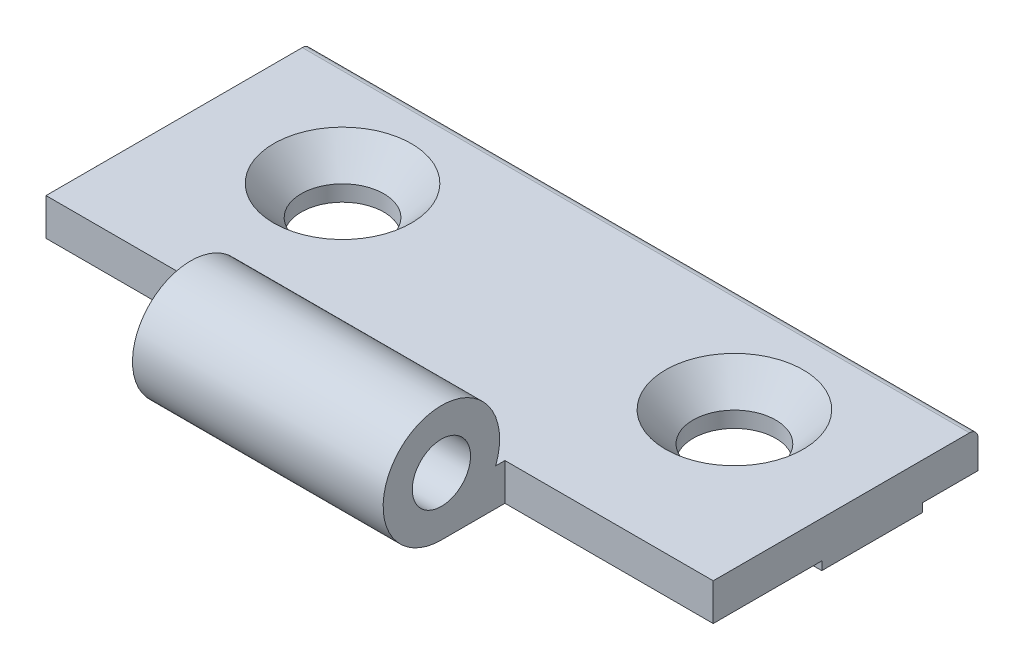
ISO-10303-21;
HEADER;
FILE_DESCRIPTION(('STEP AP214'),'2;1');
FILE_NAME('part.step','',(''),(''),'','','');
FILE_SCHEMA(('AUTOMOTIVE_DESIGN { 1 0 10303 214 1 1 1 1 }'));
ENDSEC;
DATA;
#1=APPLICATION_CONTEXT('core data for automotive mechanical design processes');
#2=APPLICATION_PROTOCOL_DEFINITION('international standard','automotive_design',2000,#1);
#3=PRODUCT_CONTEXT('',#1,'mechanical');
#4=PRODUCT('Part','Part','',(#3));
#5=PRODUCT_RELATED_PRODUCT_CATEGORY('part','',(#4));
#6=PRODUCT_DEFINITION_FORMATION('','',#4);
#7=PRODUCT_DEFINITION_CONTEXT('part definition',#1,'design');
#8=PRODUCT_DEFINITION('design','',#6,#7);
#9=PRODUCT_DEFINITION_SHAPE('','',#8);
#10=(LENGTH_UNIT() NAMED_UNIT(*) SI_UNIT(.MILLI.,.METRE.));
#11=(NAMED_UNIT(*) PLANE_ANGLE_UNIT() SI_UNIT($,.RADIAN.));
#12=(NAMED_UNIT(*) SI_UNIT($,.STERADIAN.) SOLID_ANGLE_UNIT());
#13=UNCERTAINTY_MEASURE_WITH_UNIT(LENGTH_MEASURE(1.E-05),#10,'distance_accuracy_value','');
#14=(GEOMETRIC_REPRESENTATION_CONTEXT(3) GLOBAL_UNCERTAINTY_ASSIGNED_CONTEXT((#13)) GLOBAL_UNIT_ASSIGNED_CONTEXT((#10,
#11,#12)) REPRESENTATION_CONTEXT('',''));
#15=CARTESIAN_POINT('',(0.,0.,0.));
#16=DIRECTION('',(0.,0.,1.));
#17=DIRECTION('',(1.,0.,0.));
#18=AXIS2_PLACEMENT_3D('',#15,#16,#17);
#19=CARTESIAN_POINT('',(-3.94404999999999,1.64315508798022,-9.16853184544108));
#20=DIRECTION('',(0.,-1.,0.));
#21=DIRECTION('',(0.,0.,-1.));
#22=AXIS2_PLACEMENT_3D('',#19,#20,#21);
#23=PLANE('',#22);
#24=DIRECTION('',(0.,0.,1.));
#25=VECTOR('',#24,1.);
#26=CARTESIAN_POINT('',(-10.49895,1.64315508798022,-11.1683318454411));
#27=LINE('',#26,#25);
#28=CARTESIAN_POINT('',(-10.49895,1.64315508798022,-14.5846568454411));
#29=VERTEX_POINT('',#28);
#30=CARTESIAN_POINT('',(-10.49895,1.64315508798022,-11.1683318454411));
#31=VERTEX_POINT('',#30);
#32=EDGE_CURVE('E192',#29,#31,#27,.T.);
#33=ORIENTED_EDGE('',*,*,#32,.F.);
#34=DIRECTION('',(-1.,0.,0.));
#35=VECTOR('',#34,1.);
#36=CARTESIAN_POINT('',(-10.49895,1.64315508798022,-14.5846568454411));
#37=LINE('',#36,#35);
#38=CARTESIAN_POINT('',(10.49895,1.64315508798022,-14.5846568454411));
#39=VERTEX_POINT('',#38);
#40=EDGE_CURVE('E163',#39,#29,#37,.T.);
#41=ORIENTED_EDGE('',*,*,#40,.F.);
#42=DIRECTION('',(0.,0.,-1.));
#43=VECTOR('',#42,1.);
#44=CARTESIAN_POINT('',(10.49895,1.64315508798022,-19.5008318454411));
#45=LINE('',#44,#43);
#46=CARTESIAN_POINT('',(10.49895,1.64315508798022,-11.1683318454411));
#47=VERTEX_POINT('',#46);
#48=EDGE_CURVE('E180',#47,#39,#45,.T.);
#49=ORIENTED_EDGE('',*,*,#48,.F.);
#50=DIRECTION('',(-1.,0.,0.));
#51=VECTOR('',#50,1.);
#52=CARTESIAN_POINT('',(10.49895,1.64315508798022,-11.1683318454411));
#53=LINE('',#52,#51);
#54=CARTESIAN_POINT('',(3.94404999999999,1.64315508798022,-11.1683318454411));
#55=VERTEX_POINT('',#54);
#56=EDGE_CURVE('E183',#47,#55,#53,.T.);
#57=ORIENTED_EDGE('',*,*,#56,.T.);
#58=DIRECTION('',(0.,0.,-1.));
#59=VECTOR('',#58,1.);
#60=CARTESIAN_POINT('',(3.94404999999999,1.64315508798022,-9.16853184544108));
#61=LINE('',#60,#59);
#62=CARTESIAN_POINT('',(3.94404999999999,1.64315508798022,-9.16853184544108));
#63=VERTEX_POINT('',#62);
#64=EDGE_CURVE('E208',#63,#55,#61,.T.);
#65=ORIENTED_EDGE('',*,*,#64,.F.);
#66=DIRECTION('',(1.,0.,0.));
#67=VECTOR('',#66,1.);
#68=CARTESIAN_POINT('',(-3.94404999999999,1.64315508798022,-9.16853184544108));
#69=LINE('',#68,#67);
#70=CARTESIAN_POINT('',(-3.94404999999999,1.64315508798022,-9.16853184544108));
#71=VERTEX_POINT('',#70);
#72=EDGE_CURVE('E220',#71,#63,#69,.T.);
#73=ORIENTED_EDGE('',*,*,#72,.F.);
#74=DIRECTION('',(0.,0.,-1.));
#75=VECTOR('',#74,1.);
#76=CARTESIAN_POINT('',(-3.94404999999999,1.64315508798022,-9.16853184544108));
#77=LINE('',#76,#75);
#78=CARTESIAN_POINT('',(-3.94404999999999,1.64315508798022,-11.1683318454411));
#79=VERTEX_POINT('',#78);
#80=EDGE_CURVE('E211',#71,#79,#77,.T.);
#81=ORIENTED_EDGE('',*,*,#80,.T.);
#82=DIRECTION('',(1.,0.,0.));
#83=VECTOR('',#82,1.);
#84=CARTESIAN_POINT('',(-10.49895,1.64315508798022,-11.1683318454411));
#85=LINE('',#84,#83);
#86=EDGE_CURVE('E201',#31,#79,#85,.T.);
#87=ORIENTED_EDGE('',*,*,#86,.F.);
#88=EDGE_LOOP('',(#33,#41,#49,#57,#65,#73,#81,#87));
#89=FACE_BOUND('',#88,.T.);
#90=ADVANCED_FACE('F34',(#89),#23,.T.);
#91=CARTESIAN_POINT('',(-3.94404999999999,3.47630508798022,-9.16853184544108));
#92=DIRECTION('',(1.,0.,0.));
#93=DIRECTION('',(0.,0.,-1.));
#94=AXIS2_PLACEMENT_3D('',#91,#92,#93);
#95=PLANE('',#94);
#96=CARTESIAN_POINT('',(-3.94404999999999,3.47630508798022,-9.16853184544108));
#97=DIRECTION('',(-1.,0.,0.));
#98=DIRECTION('',(0.,0.,1.));
#99=AXIS2_PLACEMENT_3D('',#96,#97,#98);
#100=CIRCLE('',#99,0.916574999999996);
#101=CARTESIAN_POINT('',(-3.94404999999999,3.47630508798022,-8.25195684544109));
#102=VERTEX_POINT('',#101);
#103=EDGE_CURVE('E229',#102,#102,#100,.T.);
#104=ORIENTED_EDGE('',*,*,#103,.F.);
#105=EDGE_LOOP('',(#104));
#106=FACE_BOUND('',#105,.T.);
#107=DIRECTION('',(0.,1.,0.));
#108=VECTOR('',#107,1.);
#109=CARTESIAN_POINT('',(-3.94404999999999,2.80970508798022,-11.1683318454411));
#110=LINE('',#109,#108);
#111=CARTESIAN_POINT('',(-3.94404999999999,2.80970508798022,-11.1683318454411));
#112=VERTEX_POINT('',#111);
#113=EDGE_CURVE('E191',#79,#112,#110,.T.);
#114=ORIENTED_EDGE('',*,*,#113,.F.);
#115=ORIENTED_EDGE('',*,*,#80,.F.);
#116=CARTESIAN_POINT('',(-3.94404999999999,3.47630508798022,-9.16853184544108));
#117=DIRECTION('',(1.,0.,0.));
#118=DIRECTION('',(0.,0.,-1.));
#119=AXIS2_PLACEMENT_3D('',#116,#117,#118);
#120=CIRCLE('',#119,1.83315);
#121=CARTESIAN_POINT('',(-3.94404999999999,2.80970508798022,-10.8761861905882));
#122=VERTEX_POINT('',#121);
#123=EDGE_CURVE('E207',#122,#71,#120,.T.);
#124=ORIENTED_EDGE('',*,*,#123,.F.);
#125=DIRECTION('',(0.,0.,1.));
#126=VECTOR('',#125,1.);
#127=CARTESIAN_POINT('',(-3.94404999999999,2.80970508798022,-19.5008318454411));
#128=LINE('',#127,#126);
#129=EDGE_CURVE('E205',#112,#122,#128,.T.);
#130=ORIENTED_EDGE('',*,*,#129,.F.);
#131=EDGE_LOOP('',(#114,#115,#124,#130));
#132=FACE_BOUND('',#131,.T.);
#133=ADVANCED_FACE('F263',(#106,#132),#95,.F.);
#134=CARTESIAN_POINT('',(-3.94404999999999,1.64315508798022,-19.5008318454411));
#135=DIRECTION('',(0.,0.,-1.));
#136=DIRECTION('',(-1.,0.,0.));
#137=AXIS2_PLACEMENT_3D('',#134,#135,#136);
#138=PLANE('',#137);
#139=DIRECTION('',(0.,-1.,0.));
#140=VECTOR('',#139,1.);
#141=CARTESIAN_POINT('',(-10.49895,1.64315508798022,-19.5008318454411));
#142=LINE('',#141,#140);
#143=CARTESIAN_POINT('',(-10.49895,2.54306508798022,-19.5008318454411));
#144=VERTEX_POINT('',#143);
#145=CARTESIAN_POINT('',(-10.49895,1.64315508798022,-19.5008318454411));
#146=VERTEX_POINT('',#145);
#147=EDGE_CURVE('E128',#144,#146,#142,.T.);
#148=ORIENTED_EDGE('',*,*,#147,.F.);
#149=DIRECTION('',(1.,0.,0.));
#150=VECTOR('',#149,1.);
#151=CARTESIAN_POINT('',(-3.94404999999999,2.54306508798022,-19.5008318454411));
#152=LINE('',#151,#150);
#153=CARTESIAN_POINT('',(10.49895,2.54306508798022,-19.5008318454411));
#154=VERTEX_POINT('',#153);
#155=EDGE_CURVE('E222',#144,#154,#152,.T.);
#156=ORIENTED_EDGE('',*,*,#155,.T.);
#157=DIRECTION('',(0.,1.,0.));
#158=VECTOR('',#157,1.);
#159=CARTESIAN_POINT('',(10.49895,2.80970508798022,-19.5008318454411));
#160=LINE('',#159,#158);
#161=CARTESIAN_POINT('',(10.49895,1.64315508798022,-19.5008318454411));
#162=VERTEX_POINT('',#161);
#163=EDGE_CURVE('E153',#162,#154,#160,.T.);
#164=ORIENTED_EDGE('',*,*,#163,.F.);
#165=DIRECTION('',(1.,0.,0.));
#166=VECTOR('',#165,1.);
#167=CARTESIAN_POINT('',(-10.49895,1.64315508798022,-19.5008318454411));
#168=LINE('',#167,#166);
#169=EDGE_CURVE('E144',#146,#162,#168,.T.);
#170=ORIENTED_EDGE('',*,*,#169,.F.);
#171=EDGE_LOOP('',(#148,#156,#164,#170));
#172=FACE_BOUND('',#171,.T.);
#173=ADVANCED_FACE('F152',(#172),#138,.T.);
#174=CARTESIAN_POINT('',(-3.94404999999999,3.47630508798022,-9.16853184544108));
#175=DIRECTION('',(1.,0.,0.));
#176=DIRECTION('',(0.,0.,-1.));
#177=AXIS2_PLACEMENT_3D('',#174,#175,#176);
#178=CYLINDRICAL_SURFACE('',#177,1.83315);
#179=CARTESIAN_POINT('',(3.94404999999999,3.47630508798022,-9.16853184544108));
#180=DIRECTION('',(1.,0.,0.));
#181=DIRECTION('',(0.,0.,-1.));
#182=AXIS2_PLACEMENT_3D('',#179,#180,#181);
#183=CIRCLE('',#182,1.83315);
#184=CARTESIAN_POINT('',(3.94404999999999,2.80970508798022,-10.8761861905882));
#185=VERTEX_POINT('',#184);
#186=EDGE_CURVE('E216',#185,#63,#183,.T.);
#187=ORIENTED_EDGE('',*,*,#186,.F.);
#188=DIRECTION('',(1.,0.,0.));
#189=VECTOR('',#188,1.);
#190=CARTESIAN_POINT('',(-3.94404999999999,2.80970508798022,-10.8761861905882));
#191=LINE('',#190,#189);
#192=EDGE_CURVE('E214',#122,#185,#191,.T.);
#193=ORIENTED_EDGE('',*,*,#192,.F.);
#194=ORIENTED_EDGE('',*,*,#123,.T.);
#195=ORIENTED_EDGE('',*,*,#72,.T.);
#196=EDGE_LOOP('',(#187,#193,#194,#195));
#197=FACE_BOUND('',#196,.T.);
#198=ADVANCED_FACE('F274',(#197),#178,.T.);
#199=CARTESIAN_POINT('',(-3.94404999999999,2.80970508798022,-19.5008318454411));
#200=DIRECTION('',(0.,1.,0.));
#201=DIRECTION('',(0.,0.,1.));
#202=AXIS2_PLACEMENT_3D('',#199,#200,#201);
#203=PLANE('',#202);
#204=CARTESIAN_POINT('',(-6.16605,2.80970508798022,-16.1678318454411));
#205=DIRECTION('',(0.,1.,0.));
#206=DIRECTION('',(0.,0.,1.));
#207=AXIS2_PLACEMENT_3D('',#204,#205,#206);
#208=CIRCLE('',#207,2.16645);
#209=CARTESIAN_POINT('',(-6.16605,2.80970508798022,-14.0013818454411));
#210=VERTEX_POINT('',#209);
#211=EDGE_CURVE('E413',#210,#210,#208,.T.);
#212=ORIENTED_EDGE('',*,*,#211,.F.);
#213=EDGE_LOOP('',(#212));
#214=FACE_BOUND('',#213,.T.);
#215=CARTESIAN_POINT('',(6.16605,2.80970508798022,-16.1678318454411));
#216=DIRECTION('',(0.,1.,0.));
#217=DIRECTION('',(0.,0.,1.));
#218=AXIS2_PLACEMENT_3D('',#215,#216,#217);
#219=CIRCLE('',#218,2.16645);
#220=CARTESIAN_POINT('',(6.16605,2.80970508798022,-14.0013818454411));
#221=VERTEX_POINT('',#220);
#222=EDGE_CURVE('E420',#221,#221,#219,.T.);
#223=ORIENTED_EDGE('',*,*,#222,.F.);
#224=EDGE_LOOP('',(#223));
#225=FACE_BOUND('',#224,.T.);
#226=DIRECTION('',(0.,0.,1.));
#227=VECTOR('',#226,1.);
#228=CARTESIAN_POINT('',(10.49895,2.80970508798022,-11.1683318454411));
#229=LINE('',#228,#227);
#230=CARTESIAN_POINT('',(10.49895,2.80970508798022,-19.2341918454411));
#231=VERTEX_POINT('',#230);
#232=CARTESIAN_POINT('',(10.49895,2.80970508798022,-11.1683318454411));
#233=VERTEX_POINT('',#232);
#234=EDGE_CURVE('E176',#231,#233,#229,.T.);
#235=ORIENTED_EDGE('',*,*,#234,.F.);
#236=DIRECTION('',(1.,0.,0.));
#237=VECTOR('',#236,1.);
#238=CARTESIAN_POINT('',(-3.94404999999999,2.80970508798022,-19.2341918454411));
#239=LINE('',#238,#237);
#240=CARTESIAN_POINT('',(-10.49895,2.80970508798022,-19.2341918454411));
#241=VERTEX_POINT('',#240);
#242=EDGE_CURVE('E42',#231,#241,#239,.F.);
#243=ORIENTED_EDGE('',*,*,#242,.T.);
#244=DIRECTION('',(0.,0.,-1.));
#245=VECTOR('',#244,1.);
#246=CARTESIAN_POINT('',(-10.49895,2.80970508798022,-19.5008318454411));
#247=LINE('',#246,#245);
#248=CARTESIAN_POINT('',(-10.49895,2.80970508798022,-11.1683318454411));
#249=VERTEX_POINT('',#248);
#250=EDGE_CURVE('E139',#249,#241,#247,.T.);
#251=ORIENTED_EDGE('',*,*,#250,.F.);
#252=DIRECTION('',(1.,0.,0.));
#253=VECTOR('',#252,1.);
#254=CARTESIAN_POINT('',(-10.49895,2.80970508798022,-11.1683318454411));
#255=LINE('',#254,#253);
#256=EDGE_CURVE('E138',#249,#112,#255,.T.);
#257=ORIENTED_EDGE('',*,*,#256,.T.);
#258=ORIENTED_EDGE('',*,*,#129,.T.);
#259=ORIENTED_EDGE('',*,*,#192,.T.);
#260=DIRECTION('',(0.,0.,1.));
#261=VECTOR('',#260,1.);
#262=CARTESIAN_POINT('',(3.94404999999999,2.80970508798022,-19.5008318454411));
#263=LINE('',#262,#261);
#264=CARTESIAN_POINT('',(3.94404999999999,2.80970508798022,-11.1683318454411));
#265=VERTEX_POINT('',#264);
#266=EDGE_CURVE('E204',#265,#185,#263,.T.);
#267=ORIENTED_EDGE('',*,*,#266,.F.);
#268=DIRECTION('',(-1.,0.,0.));
#269=VECTOR('',#268,1.);
#270=CARTESIAN_POINT('',(10.49895,2.80970508798022,-11.1683318454411));
#271=LINE('',#270,#269);
#272=EDGE_CURVE('E188',#233,#265,#271,.T.);
#273=ORIENTED_EDGE('',*,*,#272,.F.);
#274=EDGE_LOOP('',(#235,#243,#251,#257,#258,#259,#267,#273));
#275=FACE_BOUND('',#274,.T.);
#276=ADVANCED_FACE('F277',(#214,#225,#275),#203,.T.);
#277=CARTESIAN_POINT('',(3.94404999999999,3.47630508798022,-9.16853184544108));
#278=DIRECTION('',(1.,0.,0.));
#279=DIRECTION('',(0.,0.,-1.));
#280=AXIS2_PLACEMENT_3D('',#277,#278,#279);
#281=PLANE('',#280);
#282=CARTESIAN_POINT('',(3.94404999999999,3.47630508798022,-9.16853184544108));
#283=DIRECTION('',(1.,0.,0.));
#284=DIRECTION('',(0.,0.,-1.));
#285=AXIS2_PLACEMENT_3D('',#282,#283,#284);
#286=CIRCLE('',#285,0.916574999999995);
#287=CARTESIAN_POINT('',(3.94404999999999,3.47630508798022,-10.0851068454411));
#288=VERTEX_POINT('',#287);
#289=EDGE_CURVE('E225',#288,#288,#286,.T.);
#290=ORIENTED_EDGE('',*,*,#289,.F.);
#291=EDGE_LOOP('',(#290));
#292=FACE_BOUND('',#291,.T.);
#293=DIRECTION('',(0.,-1.,0.));
#294=VECTOR('',#293,1.);
#295=CARTESIAN_POINT('',(3.94404999999999,1.64315508798022,-11.1683318454411));
#296=LINE('',#295,#294);
#297=EDGE_CURVE('E174',#265,#55,#296,.T.);
#298=ORIENTED_EDGE('',*,*,#297,.F.);
#299=ORIENTED_EDGE('',*,*,#266,.T.);
#300=ORIENTED_EDGE('',*,*,#186,.T.);
#301=ORIENTED_EDGE('',*,*,#64,.T.);
#302=EDGE_LOOP('',(#298,#299,#300,#301));
#303=FACE_BOUND('',#302,.T.);
#304=ADVANCED_FACE('F273',(#292,#303),#281,.T.);
#305=CARTESIAN_POINT('',(-10.49895,2.80970508798022,-11.1683318454411));
#306=DIRECTION('',(0.,0.,-1.));
#307=DIRECTION('',(-1.,0.,0.));
#308=AXIS2_PLACEMENT_3D('',#305,#306,#307);
#309=PLANE('',#308);
#310=ORIENTED_EDGE('',*,*,#113,.T.);
#311=ORIENTED_EDGE('',*,*,#256,.F.);
#312=DIRECTION('',(0.,1.,0.));
#313=VECTOR('',#312,1.);
#314=CARTESIAN_POINT('',(-10.49895,2.80970508798022,-11.1683318454411));
#315=LINE('',#314,#313);
#316=EDGE_CURVE('E194',#31,#249,#315,.T.);
#317=ORIENTED_EDGE('',*,*,#316,.F.);
#318=ORIENTED_EDGE('',*,*,#86,.T.);
#319=EDGE_LOOP('',(#310,#311,#317,#318));
#320=FACE_BOUND('',#319,.T.);
#321=ADVANCED_FACE('F300',(#320),#309,.F.);
#322=CARTESIAN_POINT('',(-10.49895,1.64315508798022,-9.16853184544108));
#323=DIRECTION('',(1.,0.,0.));
#324=DIRECTION('',(0.,0.,-1.));
#325=AXIS2_PLACEMENT_3D('',#322,#323,#324);
#326=PLANE('',#325);
#327=ORIENTED_EDGE('',*,*,#250,.T.);
#328=CARTESIAN_POINT('',(-10.49895,2.54306508798022,-19.2341918454411));
#329=DIRECTION('',(1.,0.,0.));
#330=DIRECTION('',(0.,0.,-1.));
#331=AXIS2_PLACEMENT_3D('',#328,#329,#330);
#332=CIRCLE('',#331,0.26664);
#333=EDGE_CURVE('E11',#241,#144,#332,.F.);
#334=ORIENTED_EDGE('',*,*,#333,.T.);
#335=ORIENTED_EDGE('',*,*,#147,.T.);
#336=DIRECTION('',(0.,0.,1.));
#337=VECTOR('',#336,1.);
#338=CARTESIAN_POINT('',(-10.49895,1.64315508798022,-19.5008318454411));
#339=LINE('',#338,#337);
#340=CARTESIAN_POINT('',(-10.49895,1.64315508798022,-17.7510068454411));
#341=VERTEX_POINT('',#340);
#342=EDGE_CURVE('E132',#146,#341,#339,.T.);
#343=ORIENTED_EDGE('',*,*,#342,.T.);
#344=DIRECTION('',(0.,-1.,0.));
#345=VECTOR('',#344,1.);
#346=CARTESIAN_POINT('',(-10.49895,1.64315508798022,-17.7510068454411));
#347=LINE('',#346,#345);
#348=CARTESIAN_POINT('',(-10.49895,1.37651508798022,-17.7510068454411));
#349=VERTEX_POINT('',#348);
#350=EDGE_CURVE('E148',#341,#349,#347,.T.);
#351=ORIENTED_EDGE('',*,*,#350,.T.);
#352=DIRECTION('',(0.,0.,-1.));
#353=VECTOR('',#352,1.);
#354=CARTESIAN_POINT('',(-10.49895,1.37651508798022,-19.5008318454411));
#355=LINE('',#354,#353);
#356=CARTESIAN_POINT('',(-10.49895,1.37651508798022,-14.5846568454411));
#357=VERTEX_POINT('',#356);
#358=EDGE_CURVE('E165',#357,#349,#355,.T.);
#359=ORIENTED_EDGE('',*,*,#358,.F.);
#360=DIRECTION('',(0.,1.,0.));
#361=VECTOR('',#360,1.);
#362=CARTESIAN_POINT('',(-10.49895,1.37651508798022,-14.5846568454411));
#363=LINE('',#362,#361);
#364=EDGE_CURVE('E168',#357,#29,#363,.T.);
#365=ORIENTED_EDGE('',*,*,#364,.T.);
#366=ORIENTED_EDGE('',*,*,#32,.T.);
#367=ORIENTED_EDGE('',*,*,#316,.T.);
#368=EDGE_LOOP('',(#327,#334,#335,#343,#351,#359,#365,#366,#367));
#369=FACE_BOUND('',#368,.T.);
#370=ADVANCED_FACE('F130',(#369),#326,.F.);
#371=CARTESIAN_POINT('',(10.49895,1.64315508798022,-11.1683318454411));
#372=DIRECTION('',(0.,0.,-1.));
#373=DIRECTION('',(-1.,0.,0.));
#374=AXIS2_PLACEMENT_3D('',#371,#372,#373);
#375=PLANE('',#374);
#376=ORIENTED_EDGE('',*,*,#297,.T.);
#377=ORIENTED_EDGE('',*,*,#56,.F.);
#378=DIRECTION('',(0.,-1.,0.));
#379=VECTOR('',#378,1.);
#380=CARTESIAN_POINT('',(10.49895,1.64315508798022,-11.1683318454411));
#381=LINE('',#380,#379);
#382=EDGE_CURVE('E178',#233,#47,#381,.T.);
#383=ORIENTED_EDGE('',*,*,#382,.F.);
#384=ORIENTED_EDGE('',*,*,#272,.T.);
#385=EDGE_LOOP('',(#376,#377,#383,#384));
#386=FACE_BOUND('',#385,.T.);
#387=ADVANCED_FACE('F314',(#386),#375,.F.);
#388=CARTESIAN_POINT('',(10.49895,1.64315508798022,-9.16853184544108));
#389=DIRECTION('',(-1.,0.,0.));
#390=DIRECTION('',(0.,0.,1.));
#391=AXIS2_PLACEMENT_3D('',#388,#389,#390);
#392=PLANE('',#391);
#393=ORIENTED_EDGE('',*,*,#163,.T.);
#394=CARTESIAN_POINT('',(10.49895,2.54306508798022,-19.2341918454411));
#395=DIRECTION('',(-1.,0.,0.));
#396=DIRECTION('',(0.,0.,1.));
#397=AXIS2_PLACEMENT_3D('',#394,#395,#396);
#398=CIRCLE('',#397,0.26664);
#399=EDGE_CURVE('E56',#154,#231,#398,.F.);
#400=ORIENTED_EDGE('',*,*,#399,.T.);
#401=ORIENTED_EDGE('',*,*,#234,.T.);
#402=ORIENTED_EDGE('',*,*,#382,.T.);
#403=ORIENTED_EDGE('',*,*,#48,.T.);
#404=DIRECTION('',(0.,1.,0.));
#405=VECTOR('',#404,1.);
#406=CARTESIAN_POINT('',(10.49895,1.37651508798022,-14.5846568454411));
#407=LINE('',#406,#405);
#408=CARTESIAN_POINT('',(10.49895,1.37651508798022,-14.5846568454411));
#409=VERTEX_POINT('',#408);
#410=EDGE_CURVE('E172',#409,#39,#407,.T.);
#411=ORIENTED_EDGE('',*,*,#410,.F.);
#412=DIRECTION('',(0.,0.,1.));
#413=VECTOR('',#412,1.);
#414=CARTESIAN_POINT('',(10.49895,1.37651508798022,-14.5846568454411));
#415=LINE('',#414,#413);
#416=CARTESIAN_POINT('',(10.49895,1.37651508798022,-17.7510068454411));
#417=VERTEX_POINT('',#416);
#418=EDGE_CURVE('E160',#417,#409,#415,.T.);
#419=ORIENTED_EDGE('',*,*,#418,.F.);
#420=DIRECTION('',(0.,-1.,0.));
#421=VECTOR('',#420,1.);
#422=CARTESIAN_POINT('',(10.49895,1.64315508798022,-17.7510068454411));
#423=LINE('',#422,#421);
#424=CARTESIAN_POINT('',(10.49895,1.64315508798022,-17.7510068454411));
#425=VERTEX_POINT('',#424);
#426=EDGE_CURVE('E149',#425,#417,#423,.T.);
#427=ORIENTED_EDGE('',*,*,#426,.F.);
#428=DIRECTION('',(0.,0.,1.));
#429=VECTOR('',#428,1.);
#430=CARTESIAN_POINT('',(10.49895,1.64315508798022,-19.5008318454411));
#431=LINE('',#430,#429);
#432=EDGE_CURVE('E228',#162,#425,#431,.T.);
#433=ORIENTED_EDGE('',*,*,#432,.F.);
#434=EDGE_LOOP('',(#393,#400,#401,#402,#403,#411,#419,#427,#433));
#435=FACE_BOUND('',#434,.T.);
#436=ADVANCED_FACE('F232',(#435),#392,.F.);
#437=CARTESIAN_POINT('',(-10.49895,1.37651508798022,-14.5846568454411));
#438=DIRECTION('',(0.,0.,-1.));
#439=DIRECTION('',(0.,1.,0.));
#440=AXIS2_PLACEMENT_3D('',#437,#438,#439);
#441=PLANE('',#440);
#442=ORIENTED_EDGE('',*,*,#40,.T.);
#443=ORIENTED_EDGE('',*,*,#364,.F.);
#444=DIRECTION('',(-1.,0.,0.));
#445=VECTOR('',#444,1.);
#446=CARTESIAN_POINT('',(-10.49895,1.37651508798022,-14.5846568454411));
#447=LINE('',#446,#445);
#448=EDGE_CURVE('E162',#409,#357,#447,.T.);
#449=ORIENTED_EDGE('',*,*,#448,.F.);
#450=ORIENTED_EDGE('',*,*,#410,.T.);
#451=EDGE_LOOP('',(#442,#443,#449,#450));
#452=FACE_BOUND('',#451,.T.);
#453=ADVANCED_FACE('F248',(#452),#441,.F.);
#454=CARTESIAN_POINT('',(0.,1.37651508798022,-9.16853184544108));
#455=DIRECTION('',(0.,1.,0.));
#456=DIRECTION('',(0.,0.,1.));
#457=AXIS2_PLACEMENT_3D('',#454,#455,#456);
#458=PLANE('',#457);
#459=CARTESIAN_POINT('',(-6.16605,1.37651508798022,-16.1678318454411));
#460=DIRECTION('',(0.,1.,0.));
#461=DIRECTION('',(0.,0.,1.));
#462=AXIS2_PLACEMENT_3D('',#459,#460,#461);
#463=CIRCLE('',#462,1.29987);
#464=CARTESIAN_POINT('',(-6.16605,1.37651508798022,-14.8679618454411));
#465=VERTEX_POINT('',#464);
#466=EDGE_CURVE('E415',#465,#465,#463,.T.);
#467=ORIENTED_EDGE('',*,*,#466,.T.);
#468=EDGE_LOOP('',(#467));
#469=FACE_BOUND('',#468,.T.);
#470=CARTESIAN_POINT('',(6.16605,1.37651508798022,-16.1678318454411));
#471=DIRECTION('',(0.,1.,0.));
#472=DIRECTION('',(0.,0.,1.));
#473=AXIS2_PLACEMENT_3D('',#470,#471,#472);
#474=CIRCLE('',#473,1.29987);
#475=CARTESIAN_POINT('',(6.16605,1.37651508798022,-14.8679618454411));
#476=VERTEX_POINT('',#475);
#477=EDGE_CURVE('E426',#476,#476,#474,.T.);
#478=ORIENTED_EDGE('',*,*,#477,.T.);
#479=EDGE_LOOP('',(#478));
#480=FACE_BOUND('',#479,.T.);
#481=ORIENTED_EDGE('',*,*,#358,.T.);
#482=DIRECTION('',(1.,0.,0.));
#483=VECTOR('',#482,1.);
#484=CARTESIAN_POINT('',(-10.49895,1.37651508798022,-17.7510068454411));
#485=LINE('',#484,#483);
#486=EDGE_CURVE('E155',#349,#417,#485,.T.);
#487=ORIENTED_EDGE('',*,*,#486,.T.);
#488=ORIENTED_EDGE('',*,*,#418,.T.);
#489=ORIENTED_EDGE('',*,*,#448,.T.);
#490=EDGE_LOOP('',(#481,#487,#488,#489));
#491=FACE_BOUND('',#490,.T.);
#492=ADVANCED_FACE('F239',(#469,#480,#491),#458,.F.);
#493=CARTESIAN_POINT('',(-10.49895,1.64315508798022,-17.7510068454411));
#494=DIRECTION('',(0.,0.,1.));
#495=DIRECTION('',(1.,0.,0.));
#496=AXIS2_PLACEMENT_3D('',#493,#494,#495);
#497=PLANE('',#496);
#498=ORIENTED_EDGE('',*,*,#426,.T.);
#499=ORIENTED_EDGE('',*,*,#486,.F.);
#500=ORIENTED_EDGE('',*,*,#350,.F.);
#501=DIRECTION('',(1.,0.,0.));
#502=VECTOR('',#501,1.);
#503=CARTESIAN_POINT('',(-10.49895,1.64315508798022,-17.7510068454411));
#504=LINE('',#503,#502);
#505=EDGE_CURVE('E146',#341,#425,#504,.T.);
#506=ORIENTED_EDGE('',*,*,#505,.T.);
#507=EDGE_LOOP('',(#498,#499,#500,#506));
#508=FACE_BOUND('',#507,.T.);
#509=ADVANCED_FACE('F250',(#508),#497,.F.);
#510=CARTESIAN_POINT('',(-10.49895,1.64315508798022,-19.5008318454411));
#511=DIRECTION('',(0.,1.,0.));
#512=DIRECTION('',(0.,0.,1.));
#513=AXIS2_PLACEMENT_3D('',#510,#511,#512);
#514=PLANE('',#513);
#515=ORIENTED_EDGE('',*,*,#432,.T.);
#516=ORIENTED_EDGE('',*,*,#505,.F.);
#517=ORIENTED_EDGE('',*,*,#342,.F.);
#518=ORIENTED_EDGE('',*,*,#169,.T.);
#519=EDGE_LOOP('',(#515,#516,#517,#518));
#520=FACE_BOUND('',#519,.T.);
#521=ADVANCED_FACE('F143',(#520),#514,.F.);
#522=CARTESIAN_POINT('',(-3.94404999999999,3.47630508798022,-9.16853184544108));
#523=DIRECTION('',(-1.,0.,0.));
#524=DIRECTION('',(0.,0.,1.));
#525=AXIS2_PLACEMENT_3D('',#522,#523,#524);
#526=CYLINDRICAL_SURFACE('',#525,0.916574999999995);
#527=ORIENTED_EDGE('',*,*,#289,.T.);
#528=EDGE_LOOP('',(#527));
#529=FACE_BOUND('',#528,.T.);
#530=ORIENTED_EDGE('',*,*,#103,.T.);
#531=EDGE_LOOP('',(#530));
#532=FACE_BOUND('',#531,.T.);
#533=ADVANCED_FACE('F257',(#529,#532),#526,.F.);
#534=CARTESIAN_POINT('',(6.16605,2.80970508798022,-16.1678318454411));
#535=DIRECTION('',(0.,1.,0.));
#536=DIRECTION('',(0.,0.,1.));
#537=AXIS2_PLACEMENT_3D('',#534,#535,#536);
#538=CYLINDRICAL_SURFACE('',#537,1.29987);
#539=ORIENTED_EDGE('',*,*,#477,.F.);
#540=EDGE_LOOP('',(#539));
#541=FACE_BOUND('',#540,.T.);
#542=CARTESIAN_POINT('',(6.16605,1.87646508798022,-16.1678318454411));
#543=DIRECTION('',(0.,1.,0.));
#544=DIRECTION('',(0.,0.,1.));
#545=AXIS2_PLACEMENT_3D('',#542,#543,#544);
#546=CIRCLE('',#545,1.29987);
#547=CARTESIAN_POINT('',(6.16605,1.87646508798022,-14.8679618454411));
#548=VERTEX_POINT('',#547);
#549=EDGE_CURVE('E423',#548,#548,#546,.T.);
#550=ORIENTED_EDGE('',*,*,#549,.T.);
#551=EDGE_LOOP('',(#550));
#552=FACE_BOUND('',#551,.T.);
#553=ADVANCED_FACE('F357',(#541,#552),#538,.F.);
#554=CARTESIAN_POINT('',(6.16605,2.80970508798022,-16.1678318454411));
#555=DIRECTION('',(0.,1.,0.));
#556=DIRECTION('',(0.,0.,1.));
#557=AXIS2_PLACEMENT_3D('',#554,#555,#556);
#558=CONICAL_SURFACE('',#557,2.16645,0.748378047523518);
#559=ORIENTED_EDGE('',*,*,#549,.F.);
#560=EDGE_LOOP('',(#559));
#561=FACE_BOUND('',#560,.T.);
#562=ORIENTED_EDGE('',*,*,#222,.T.);
#563=EDGE_LOOP('',(#562));
#564=FACE_BOUND('',#563,.T.);
#565=ADVANCED_FACE('F366',(#561,#564),#558,.F.);
#566=CARTESIAN_POINT('',(-6.16605,2.80970508798022,-16.1678318454411));
#567=DIRECTION('',(0.,1.,0.));
#568=DIRECTION('',(0.,0.,1.));
#569=AXIS2_PLACEMENT_3D('',#566,#567,#568);
#570=CYLINDRICAL_SURFACE('',#569,1.29987);
#571=ORIENTED_EDGE('',*,*,#466,.F.);
#572=EDGE_LOOP('',(#571));
#573=FACE_BOUND('',#572,.T.);
#574=CARTESIAN_POINT('',(-6.16605,1.87646508798022,-16.1678318454411));
#575=DIRECTION('',(0.,1.,0.));
#576=DIRECTION('',(0.,0.,1.));
#577=AXIS2_PLACEMENT_3D('',#574,#575,#576);
#578=CIRCLE('',#577,1.29987);
#579=CARTESIAN_POINT('',(-6.16605,1.87646508798022,-14.8679618454411));
#580=VERTEX_POINT('',#579);
#581=EDGE_CURVE('E410',#580,#580,#578,.T.);
#582=ORIENTED_EDGE('',*,*,#581,.T.);
#583=EDGE_LOOP('',(#582));
#584=FACE_BOUND('',#583,.T.);
#585=ADVANCED_FACE('F376',(#573,#584),#570,.F.);
#586=CARTESIAN_POINT('',(-6.16605,2.80970508798022,-16.1678318454411));
#587=DIRECTION('',(0.,1.,0.));
#588=DIRECTION('',(0.,0.,1.));
#589=AXIS2_PLACEMENT_3D('',#586,#587,#588);
#590=CONICAL_SURFACE('',#589,2.16645,0.748378047523518);
#591=ORIENTED_EDGE('',*,*,#581,.F.);
#592=EDGE_LOOP('',(#591));
#593=FACE_BOUND('',#592,.T.);
#594=ORIENTED_EDGE('',*,*,#211,.T.);
#595=EDGE_LOOP('',(#594));
#596=FACE_BOUND('',#595,.T.);
#597=ADVANCED_FACE('F386',(#593,#596),#590,.F.);
#598=CARTESIAN_POINT('',(-3.94404999999999,2.54306508798022,-19.2341918454411));
#599=DIRECTION('',(1.,0.,0.));
#600=DIRECTION('',(0.,0.,-1.));
#601=AXIS2_PLACEMENT_3D('',#598,#599,#600);
#602=CYLINDRICAL_SURFACE('',#601,0.26664);
#603=ORIENTED_EDGE('',*,*,#333,.F.);
#604=ORIENTED_EDGE('',*,*,#242,.F.);
#605=ORIENTED_EDGE('',*,*,#399,.F.);
#606=ORIENTED_EDGE('',*,*,#155,.F.);
#607=EDGE_LOOP('',(#603,#604,#605,#606));
#608=FACE_BOUND('',#607,.T.);
#609=ADVANCED_FACE('F36',(#608),#602,.T.);
#610=CLOSED_SHELL('',(#90,#133,#173,#198,#276,#304,#321,#370,#387,#436,#453,#492,#509,#521,#533,
#553,#565,#585,#597,#609));
#611=MANIFOLD_SOLID_BREP('B2',#610);
#612=ADVANCED_BREP_SHAPE_REPRESENTATION('',(#18,#611),#14);
#613=SHAPE_DEFINITION_REPRESENTATION(#9,#612);
ENDSEC;
END-ISO-10303-21;
